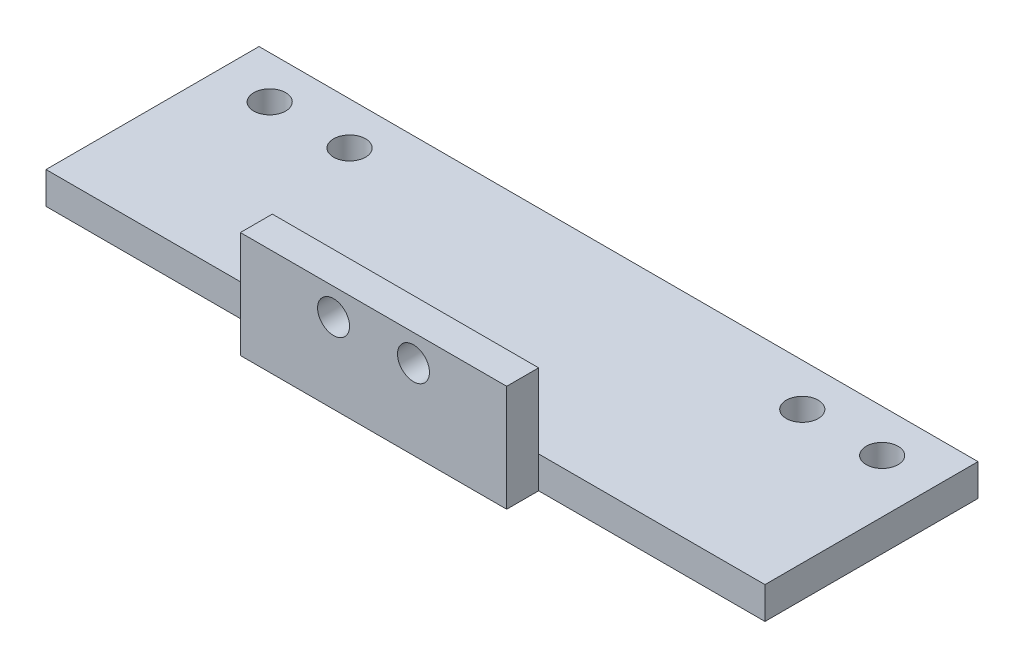
ISO-10303-21;
HEADER;
FILE_DESCRIPTION(('STEP AP214'),'2;1');
FILE_NAME('part.step','',(''),(''),'','','');
FILE_SCHEMA(('AUTOMOTIVE_DESIGN { 1 0 10303 214 1 1 1 1 }'));
ENDSEC;
DATA;
#1=APPLICATION_CONTEXT('core data for automotive mechanical design processes');
#2=APPLICATION_PROTOCOL_DEFINITION('international standard','automotive_design',2000,#1);
#3=PRODUCT_CONTEXT('',#1,'mechanical');
#4=PRODUCT('Part','Part','',(#3));
#5=PRODUCT_RELATED_PRODUCT_CATEGORY('part','',(#4));
#6=PRODUCT_DEFINITION_FORMATION('','',#4);
#7=PRODUCT_DEFINITION_CONTEXT('part definition',#1,'design');
#8=PRODUCT_DEFINITION('design','',#6,#7);
#9=PRODUCT_DEFINITION_SHAPE('','',#8);
#10=(LENGTH_UNIT() NAMED_UNIT(*) SI_UNIT(.MILLI.,.METRE.));
#11=(NAMED_UNIT(*) PLANE_ANGLE_UNIT() SI_UNIT($,.RADIAN.));
#12=(NAMED_UNIT(*) SI_UNIT($,.STERADIAN.) SOLID_ANGLE_UNIT());
#13=UNCERTAINTY_MEASURE_WITH_UNIT(LENGTH_MEASURE(1.E-05),#10,'distance_accuracy_value','');
#14=(GEOMETRIC_REPRESENTATION_CONTEXT(3) GLOBAL_UNCERTAINTY_ASSIGNED_CONTEXT((#13)) GLOBAL_UNIT_ASSIGNED_CONTEXT((#10,
#11,#12)) REPRESENTATION_CONTEXT('',''));
#15=CARTESIAN_POINT('',(0.,0.,0.));
#16=DIRECTION('',(0.,0.,1.));
#17=DIRECTION('',(1.,0.,0.));
#18=AXIS2_PLACEMENT_3D('',#15,#16,#17);
#19=CARTESIAN_POINT('',(-25.,20.,-3.));
#20=DIRECTION('',(0.,0.,1.));
#21=DIRECTION('',(1.,0.,0.));
#22=AXIS2_PLACEMENT_3D('',#19,#20,#21);
#23=PLANE('',#22);
#24=CARTESIAN_POINT('',(-7.49999999999999,15.,-3.));
#25=DIRECTION('',(0.,0.,-1.));
#26=DIRECTION('',(-1.,0.,0.));
#27=AXIS2_PLACEMENT_3D('',#24,#25,#26);
#28=CIRCLE('',#27,3.);
#29=CARTESIAN_POINT('',(-10.5,15.,-3.));
#30=VERTEX_POINT('',#29);
#31=EDGE_CURVE('E149',#30,#30,#28,.T.);
#32=ORIENTED_EDGE('',*,*,#31,.F.);
#33=EDGE_LOOP('',(#32));
#34=FACE_BOUND('',#33,.T.);
#35=CARTESIAN_POINT('',(7.50000000000001,15.,-3.));
#36=DIRECTION('',(0.,0.,-1.));
#37=DIRECTION('',(-1.,0.,0.));
#38=AXIS2_PLACEMENT_3D('',#35,#36,#37);
#39=CIRCLE('',#38,3.);
#40=CARTESIAN_POINT('',(4.50000000000001,15.,-3.));
#41=VERTEX_POINT('',#40);
#42=EDGE_CURVE('E165',#41,#41,#39,.T.);
#43=ORIENTED_EDGE('',*,*,#42,.F.);
#44=EDGE_LOOP('',(#43));
#45=FACE_BOUND('',#44,.T.);
#46=DIRECTION('',(1.,0.,0.));
#47=VECTOR('',#46,1.);
#48=CARTESIAN_POINT('',(67.5,6.00000000000001,-3.));
#49=LINE('',#48,#47);
#50=CARTESIAN_POINT('',(-25.,6.,-3.));
#51=VERTEX_POINT('',#50);
#52=CARTESIAN_POINT('',(25.,6.,-3.));
#53=VERTEX_POINT('',#52);
#54=EDGE_CURVE('E11',#51,#53,#49,.T.);
#55=ORIENTED_EDGE('',*,*,#54,.F.);
#56=DIRECTION('',(0.,-1.,0.));
#57=VECTOR('',#56,1.);
#58=CARTESIAN_POINT('',(-25.,20.,-3.));
#59=LINE('',#58,#57);
#60=CARTESIAN_POINT('',(-25.,20.,-3.));
#61=VERTEX_POINT('',#60);
#62=EDGE_CURVE('E195',#61,#51,#59,.T.);
#63=ORIENTED_EDGE('',*,*,#62,.F.);
#64=DIRECTION('',(-1.,0.,0.));
#65=VECTOR('',#64,1.);
#66=CARTESIAN_POINT('',(-25.,20.,-3.));
#67=LINE('',#66,#65);
#68=CARTESIAN_POINT('',(25.,20.,-3.));
#69=VERTEX_POINT('',#68);
#70=EDGE_CURVE('E91',#69,#61,#67,.T.);
#71=ORIENTED_EDGE('',*,*,#70,.F.);
#72=DIRECTION('',(0.,-1.,0.));
#73=VECTOR('',#72,1.);
#74=CARTESIAN_POINT('',(25.,20.,-3.));
#75=LINE('',#74,#73);
#76=EDGE_CURVE('E43',#69,#53,#75,.T.);
#77=ORIENTED_EDGE('',*,*,#76,.T.);
#78=EDGE_LOOP('',(#55,#63,#71,#77));
#79=FACE_BOUND('',#78,.T.);
#80=ADVANCED_FACE('F39',(#34,#45,#79),#23,.F.);
#81=CARTESIAN_POINT('',(25.,20.,-3.));
#82=DIRECTION('',(-1.,0.,0.));
#83=DIRECTION('',(0.,0.,1.));
#84=AXIS2_PLACEMENT_3D('',#81,#82,#83);
#85=PLANE('',#84);
#86=DIRECTION('',(0.,0.,-1.));
#87=VECTOR('',#86,1.);
#88=CARTESIAN_POINT('',(25.,0.,-3.));
#89=LINE('',#88,#87);
#90=CARTESIAN_POINT('',(25.,0.,3.));
#91=VERTEX_POINT('',#90);
#92=CARTESIAN_POINT('',(25.,0.,-3.));
#93=VERTEX_POINT('',#92);
#94=EDGE_CURVE('E164',#91,#93,#89,.T.);
#95=ORIENTED_EDGE('',*,*,#94,.T.);
#96=EDGE_CURVE('E197',#53,#93,#75,.T.);
#97=ORIENTED_EDGE('',*,*,#96,.F.);
#98=ORIENTED_EDGE('',*,*,#76,.F.);
#99=DIRECTION('',(0.,0.,-1.));
#100=VECTOR('',#99,1.);
#101=CARTESIAN_POINT('',(25.,20.,-3.));
#102=LINE('',#101,#100);
#103=CARTESIAN_POINT('',(25.,20.,3.));
#104=VERTEX_POINT('',#103);
#105=EDGE_CURVE('E172',#104,#69,#102,.T.);
#106=ORIENTED_EDGE('',*,*,#105,.F.);
#107=DIRECTION('',(0.,-1.,0.));
#108=VECTOR('',#107,1.);
#109=CARTESIAN_POINT('',(25.,20.,3.));
#110=LINE('',#109,#108);
#111=EDGE_CURVE('E182',#104,#91,#110,.T.);
#112=ORIENTED_EDGE('',*,*,#111,.T.);
#113=EDGE_LOOP('',(#95,#97,#98,#106,#112));
#114=FACE_BOUND('',#113,.T.);
#115=ADVANCED_FACE('F41',(#114),#85,.F.);
#116=CARTESIAN_POINT('',(-25.,20.,-3.));
#117=DIRECTION('',(1.,0.,0.));
#118=DIRECTION('',(0.,0.,-1.));
#119=AXIS2_PLACEMENT_3D('',#116,#117,#118);
#120=PLANE('',#119);
#121=DIRECTION('',(0.,0.,1.));
#122=VECTOR('',#121,1.);
#123=CARTESIAN_POINT('',(-25.,0.,-3.));
#124=LINE('',#123,#122);
#125=CARTESIAN_POINT('',(-25.,0.,-3.));
#126=VERTEX_POINT('',#125);
#127=CARTESIAN_POINT('',(-25.,0.,3.));
#128=VERTEX_POINT('',#127);
#129=EDGE_CURVE('E185',#126,#128,#124,.T.);
#130=ORIENTED_EDGE('',*,*,#129,.T.);
#131=DIRECTION('',(0.,-1.,0.));
#132=VECTOR('',#131,1.);
#133=CARTESIAN_POINT('',(-25.,20.,3.));
#134=LINE('',#133,#132);
#135=CARTESIAN_POINT('',(-25.,20.,3.));
#136=VERTEX_POINT('',#135);
#137=EDGE_CURVE('E192',#136,#128,#134,.T.);
#138=ORIENTED_EDGE('',*,*,#137,.F.);
#139=DIRECTION('',(0.,0.,1.));
#140=VECTOR('',#139,1.);
#141=CARTESIAN_POINT('',(-25.,20.,-3.));
#142=LINE('',#141,#140);
#143=EDGE_CURVE('E177',#61,#136,#142,.T.);
#144=ORIENTED_EDGE('',*,*,#143,.F.);
#145=ORIENTED_EDGE('',*,*,#62,.T.);
#146=EDGE_CURVE('E194',#51,#126,#59,.T.);
#147=ORIENTED_EDGE('',*,*,#146,.T.);
#148=EDGE_LOOP('',(#130,#138,#144,#145,#147));
#149=FACE_BOUND('',#148,.T.);
#150=ADVANCED_FACE('F205',(#149),#120,.F.);
#151=CARTESIAN_POINT('',(-25.,20.,3.));
#152=DIRECTION('',(0.,0.,-1.));
#153=DIRECTION('',(-1.,0.,0.));
#154=AXIS2_PLACEMENT_3D('',#151,#152,#153);
#155=PLANE('',#154);
#156=CARTESIAN_POINT('',(7.50000000000001,15.,3.));
#157=DIRECTION('',(0.,0.,-1.));
#158=DIRECTION('',(-1.,0.,0.));
#159=AXIS2_PLACEMENT_3D('',#156,#157,#158);
#160=CIRCLE('',#159,3.);
#161=CARTESIAN_POINT('',(4.50000000000001,15.,3.));
#162=VERTEX_POINT('',#161);
#163=EDGE_CURVE('E160',#162,#162,#160,.T.);
#164=ORIENTED_EDGE('',*,*,#163,.T.);
#165=EDGE_LOOP('',(#164));
#166=FACE_BOUND('',#165,.T.);
#167=CARTESIAN_POINT('',(-7.49999999999999,15.,3.));
#168=DIRECTION('',(0.,0.,-1.));
#169=DIRECTION('',(-1.,0.,0.));
#170=AXIS2_PLACEMENT_3D('',#167,#168,#169);
#171=CIRCLE('',#170,3.);
#172=CARTESIAN_POINT('',(-10.5,15.,3.));
#173=VERTEX_POINT('',#172);
#174=EDGE_CURVE('E154',#173,#173,#171,.T.);
#175=ORIENTED_EDGE('',*,*,#174,.T.);
#176=EDGE_LOOP('',(#175));
#177=FACE_BOUND('',#176,.T.);
#178=DIRECTION('',(1.,0.,0.));
#179=VECTOR('',#178,1.);
#180=CARTESIAN_POINT('',(-25.,0.,3.));
#181=LINE('',#180,#179);
#182=EDGE_CURVE('E86',#128,#91,#181,.T.);
#183=ORIENTED_EDGE('',*,*,#182,.T.);
#184=ORIENTED_EDGE('',*,*,#111,.F.);
#185=DIRECTION('',(1.,0.,0.));
#186=VECTOR('',#185,1.);
#187=CARTESIAN_POINT('',(-25.,20.,3.));
#188=LINE('',#187,#186);
#189=EDGE_CURVE('E65',#136,#104,#188,.T.);
#190=ORIENTED_EDGE('',*,*,#189,.F.);
#191=ORIENTED_EDGE('',*,*,#137,.T.);
#192=EDGE_LOOP('',(#183,#184,#190,#191));
#193=FACE_BOUND('',#192,.T.);
#194=ADVANCED_FACE('F237',(#166,#177,#193),#155,.F.);
#195=CARTESIAN_POINT('',(0.,20.,0.));
#196=DIRECTION('',(0.,1.,0.));
#197=DIRECTION('',(0.,0.,1.));
#198=AXIS2_PLACEMENT_3D('',#195,#196,#197);
#199=PLANE('',#198);
#200=ORIENTED_EDGE('',*,*,#105,.T.);
#201=ORIENTED_EDGE('',*,*,#70,.T.);
#202=ORIENTED_EDGE('',*,*,#143,.T.);
#203=ORIENTED_EDGE('',*,*,#189,.T.);
#204=EDGE_LOOP('',(#200,#201,#202,#203));
#205=FACE_BOUND('',#204,.T.);
#206=ADVANCED_FACE('F238',(#205),#199,.T.);
#207=CARTESIAN_POINT('',(0.,0.,0.));
#208=DIRECTION('',(0.,1.,0.));
#209=DIRECTION('',(0.,0.,1.));
#210=AXIS2_PLACEMENT_3D('',#207,#208,#209);
#211=PLANE('',#210);
#212=CARTESIAN_POINT('',(-57.5,0.,-35.));
#213=DIRECTION('',(0.,1.,0.));
#214=DIRECTION('',(-1.,0.,0.));
#215=AXIS2_PLACEMENT_3D('',#212,#213,#214);
#216=CIRCLE('',#215,3.);
#217=CARTESIAN_POINT('',(-60.5,0.,-35.));
#218=VERTEX_POINT('',#217);
#219=EDGE_CURVE('E297',#218,#218,#216,.T.);
#220=ORIENTED_EDGE('',*,*,#219,.T.);
#221=EDGE_LOOP('',(#220));
#222=FACE_BOUND('',#221,.T.);
#223=CARTESIAN_POINT('',(-42.5,0.,-35.));
#224=DIRECTION('',(0.,1.,0.));
#225=DIRECTION('',(-1.,0.,0.));
#226=AXIS2_PLACEMENT_3D('',#223,#224,#225);
#227=CIRCLE('',#226,3.);
#228=CARTESIAN_POINT('',(-45.5,0.,-35.));
#229=VERTEX_POINT('',#228);
#230=EDGE_CURVE('E302',#229,#229,#227,.T.);
#231=ORIENTED_EDGE('',*,*,#230,.T.);
#232=EDGE_LOOP('',(#231));
#233=FACE_BOUND('',#232,.T.);
#234=CARTESIAN_POINT('',(42.5,0.,-35.));
#235=DIRECTION('',(0.,1.,0.));
#236=DIRECTION('',(1.,0.,0.));
#237=AXIS2_PLACEMENT_3D('',#234,#235,#236);
#238=CIRCLE('',#237,3.);
#239=CARTESIAN_POINT('',(45.5,0.,-35.));
#240=VERTEX_POINT('',#239);
#241=EDGE_CURVE('E314',#240,#240,#238,.T.);
#242=ORIENTED_EDGE('',*,*,#241,.T.);
#243=EDGE_LOOP('',(#242));
#244=FACE_BOUND('',#243,.T.);
#245=CARTESIAN_POINT('',(57.5,0.,-35.));
#246=DIRECTION('',(0.,1.,0.));
#247=DIRECTION('',(1.,0.,0.));
#248=AXIS2_PLACEMENT_3D('',#245,#246,#247);
#249=CIRCLE('',#248,3.);
#250=CARTESIAN_POINT('',(60.5,0.,-35.));
#251=VERTEX_POINT('',#250);
#252=EDGE_CURVE('E322',#251,#251,#249,.T.);
#253=ORIENTED_EDGE('',*,*,#252,.T.);
#254=EDGE_LOOP('',(#253));
#255=FACE_BOUND('',#254,.T.);
#256=ORIENTED_EDGE('',*,*,#94,.F.);
#257=ORIENTED_EDGE('',*,*,#182,.F.);
#258=ORIENTED_EDGE('',*,*,#129,.F.);
#259=DIRECTION('',(-1.,0.,0.));
#260=VECTOR('',#259,1.);
#261=CARTESIAN_POINT('',(67.5,0.,-3.));
#262=LINE('',#261,#260);
#263=CARTESIAN_POINT('',(-67.5,0.,-3.));
#264=VERTEX_POINT('',#263);
#265=EDGE_CURVE('E212',#126,#264,#262,.T.);
#266=ORIENTED_EDGE('',*,*,#265,.T.);
#267=DIRECTION('',(0.,0.,1.));
#268=VECTOR('',#267,1.);
#269=CARTESIAN_POINT('',(-67.5,0.,-43.));
#270=LINE('',#269,#268);
#271=CARTESIAN_POINT('',(-67.5,0.,-43.));
#272=VERTEX_POINT('',#271);
#273=EDGE_CURVE('E222',#272,#264,#270,.T.);
#274=ORIENTED_EDGE('',*,*,#273,.F.);
#275=DIRECTION('',(-1.,0.,0.));
#276=VECTOR('',#275,1.);
#277=CARTESIAN_POINT('',(67.5,0.,-43.));
#278=LINE('',#277,#276);
#279=CARTESIAN_POINT('',(67.5,0.,-43.));
#280=VERTEX_POINT('',#279);
#281=EDGE_CURVE('E138',#280,#272,#278,.T.);
#282=ORIENTED_EDGE('',*,*,#281,.F.);
#283=DIRECTION('',(0.,0.,1.));
#284=VECTOR('',#283,1.);
#285=CARTESIAN_POINT('',(67.5,0.,-43.));
#286=LINE('',#285,#284);
#287=CARTESIAN_POINT('',(67.5,0.,-3.));
#288=VERTEX_POINT('',#287);
#289=EDGE_CURVE('E156',#280,#288,#286,.T.);
#290=ORIENTED_EDGE('',*,*,#289,.T.);
#291=EDGE_CURVE('E143',#288,#93,#262,.T.);
#292=ORIENTED_EDGE('',*,*,#291,.T.);
#293=EDGE_LOOP('',(#256,#257,#258,#266,#274,#282,#290,#292));
#294=FACE_BOUND('',#293,.T.);
#295=ADVANCED_FACE('F211',(#222,#233,#244,#255,#294),#211,.F.);
#296=CARTESIAN_POINT('',(-7.49999999999999,15.,3.));
#297=DIRECTION('',(0.,0.,-1.));
#298=DIRECTION('',(-1.,0.,0.));
#299=AXIS2_PLACEMENT_3D('',#296,#297,#298);
#300=CYLINDRICAL_SURFACE('',#299,3.);
#301=ORIENTED_EDGE('',*,*,#174,.F.);
#302=EDGE_LOOP('',(#301));
#303=FACE_BOUND('',#302,.T.);
#304=ORIENTED_EDGE('',*,*,#31,.T.);
#305=EDGE_LOOP('',(#304));
#306=FACE_BOUND('',#305,.T.);
#307=ADVANCED_FACE('F254',(#303,#306),#300,.F.);
#308=CARTESIAN_POINT('',(7.50000000000001,15.,3.));
#309=DIRECTION('',(0.,0.,-1.));
#310=DIRECTION('',(-1.,0.,0.));
#311=AXIS2_PLACEMENT_3D('',#308,#309,#310);
#312=CYLINDRICAL_SURFACE('',#311,3.);
#313=ORIENTED_EDGE('',*,*,#163,.F.);
#314=EDGE_LOOP('',(#313));
#315=FACE_BOUND('',#314,.T.);
#316=ORIENTED_EDGE('',*,*,#42,.T.);
#317=EDGE_LOOP('',(#316));
#318=FACE_BOUND('',#317,.T.);
#319=ADVANCED_FACE('F260',(#315,#318),#312,.F.);
#320=CARTESIAN_POINT('',(0.,0.,-3.));
#321=DIRECTION('',(0.,0.,-1.));
#322=DIRECTION('',(-1.,0.,0.));
#323=AXIS2_PLACEMENT_3D('',#320,#321,#322);
#324=PLANE('',#323);
#325=CARTESIAN_POINT('',(67.5,6.00000000000001,-3.));
#326=VERTEX_POINT('',#325);
#327=EDGE_CURVE('E51',#53,#326,#49,.T.);
#328=ORIENTED_EDGE('',*,*,#327,.F.);
#329=ORIENTED_EDGE('',*,*,#96,.T.);
#330=ORIENTED_EDGE('',*,*,#291,.F.);
#331=DIRECTION('',(0.,-1.,0.));
#332=VECTOR('',#331,1.);
#333=CARTESIAN_POINT('',(67.5,6.00000000000001,-3.));
#334=LINE('',#333,#332);
#335=EDGE_CURVE('E215',#326,#288,#334,.T.);
#336=ORIENTED_EDGE('',*,*,#335,.F.);
#337=EDGE_LOOP('',(#328,#329,#330,#336));
#338=FACE_BOUND('',#337,.T.);
#339=ADVANCED_FACE('F232',(#338),#324,.F.);
#340=CARTESIAN_POINT('',(-67.5,5.99999999999999,-43.));
#341=DIRECTION('',(1.,0.,0.));
#342=DIRECTION('',(0.,0.,-1.));
#343=AXIS2_PLACEMENT_3D('',#340,#341,#342);
#344=PLANE('',#343);
#345=DIRECTION('',(0.,1.,0.));
#346=VECTOR('',#345,1.);
#347=CARTESIAN_POINT('',(-67.5,5.99999999999999,-3.));
#348=LINE('',#347,#346);
#349=CARTESIAN_POINT('',(-67.5,5.99999999999999,-3.));
#350=VERTEX_POINT('',#349);
#351=EDGE_CURVE('E147',#264,#350,#348,.T.);
#352=ORIENTED_EDGE('',*,*,#351,.T.);
#353=DIRECTION('',(0.,0.,1.));
#354=VECTOR('',#353,1.);
#355=CARTESIAN_POINT('',(-67.5,5.99999999999999,-43.));
#356=LINE('',#355,#354);
#357=CARTESIAN_POINT('',(-67.5,5.99999999999999,-43.));
#358=VERTEX_POINT('',#357);
#359=EDGE_CURVE('E125',#358,#350,#356,.T.);
#360=ORIENTED_EDGE('',*,*,#359,.F.);
#361=DIRECTION('',(0.,1.,0.));
#362=VECTOR('',#361,1.);
#363=CARTESIAN_POINT('',(-67.5,5.99999999999999,-43.));
#364=LINE('',#363,#362);
#365=EDGE_CURVE('E133',#272,#358,#364,.T.);
#366=ORIENTED_EDGE('',*,*,#365,.F.);
#367=ORIENTED_EDGE('',*,*,#273,.T.);
#368=EDGE_LOOP('',(#352,#360,#366,#367));
#369=FACE_BOUND('',#368,.T.);
#370=ADVANCED_FACE('F145',(#369),#344,.F.);
#371=CARTESIAN_POINT('',(67.5,6.00000000000001,-43.));
#372=DIRECTION('',(0.,-1.,0.));
#373=DIRECTION('',(1.,0.,0.));
#374=AXIS2_PLACEMENT_3D('',#371,#372,#373);
#375=PLANE('',#374);
#376=CARTESIAN_POINT('',(-57.5,5.99999999999999,-35.));
#377=DIRECTION('',(0.,1.,0.));
#378=DIRECTION('',(-1.,0.,0.));
#379=AXIS2_PLACEMENT_3D('',#376,#377,#378);
#380=CIRCLE('',#379,3.);
#381=CARTESIAN_POINT('',(-60.5,5.99999999999999,-35.));
#382=VERTEX_POINT('',#381);
#383=EDGE_CURVE('E300',#382,#382,#380,.T.);
#384=ORIENTED_EDGE('',*,*,#383,.F.);
#385=EDGE_LOOP('',(#384));
#386=FACE_BOUND('',#385,.T.);
#387=CARTESIAN_POINT('',(-42.5,5.99999999999999,-35.));
#388=DIRECTION('',(0.,1.,0.));
#389=DIRECTION('',(-1.,0.,0.));
#390=AXIS2_PLACEMENT_3D('',#387,#388,#389);
#391=CIRCLE('',#390,3.);
#392=CARTESIAN_POINT('',(-45.5,5.99999999999999,-35.));
#393=VERTEX_POINT('',#392);
#394=EDGE_CURVE('E308',#393,#393,#391,.T.);
#395=ORIENTED_EDGE('',*,*,#394,.F.);
#396=EDGE_LOOP('',(#395));
#397=FACE_BOUND('',#396,.T.);
#398=CARTESIAN_POINT('',(42.5,6.,-35.));
#399=DIRECTION('',(0.,1.,0.));
#400=DIRECTION('',(1.,0.,0.));
#401=AXIS2_PLACEMENT_3D('',#398,#399,#400);
#402=CIRCLE('',#401,3.);
#403=CARTESIAN_POINT('',(45.5,6.,-35.));
#404=VERTEX_POINT('',#403);
#405=EDGE_CURVE('E318',#404,#404,#402,.T.);
#406=ORIENTED_EDGE('',*,*,#405,.F.);
#407=EDGE_LOOP('',(#406));
#408=FACE_BOUND('',#407,.T.);
#409=CARTESIAN_POINT('',(57.5,6.,-35.));
#410=DIRECTION('',(0.,1.,0.));
#411=DIRECTION('',(1.,0.,0.));
#412=AXIS2_PLACEMENT_3D('',#409,#410,#411);
#413=CIRCLE('',#412,3.);
#414=CARTESIAN_POINT('',(60.5,6.,-35.));
#415=VERTEX_POINT('',#414);
#416=EDGE_CURVE('E326',#415,#415,#413,.T.);
#417=ORIENTED_EDGE('',*,*,#416,.F.);
#418=EDGE_LOOP('',(#417));
#419=FACE_BOUND('',#418,.T.);
#420=EDGE_CURVE('E50',#350,#51,#49,.T.);
#421=ORIENTED_EDGE('',*,*,#420,.T.);
#422=ORIENTED_EDGE('',*,*,#54,.T.);
#423=ORIENTED_EDGE('',*,*,#327,.T.);
#424=DIRECTION('',(0.,0.,1.));
#425=VECTOR('',#424,1.);
#426=CARTESIAN_POINT('',(67.5,6.00000000000001,-43.));
#427=LINE('',#426,#425);
#428=CARTESIAN_POINT('',(67.5,6.00000000000001,-43.));
#429=VERTEX_POINT('',#428);
#430=EDGE_CURVE('E128',#429,#326,#427,.T.);
#431=ORIENTED_EDGE('',*,*,#430,.F.);
#432=DIRECTION('',(1.,0.,0.));
#433=VECTOR('',#432,1.);
#434=CARTESIAN_POINT('',(67.5,6.00000000000001,-43.));
#435=LINE('',#434,#433);
#436=EDGE_CURVE('E120',#358,#429,#435,.T.);
#437=ORIENTED_EDGE('',*,*,#436,.F.);
#438=ORIENTED_EDGE('',*,*,#359,.T.);
#439=EDGE_LOOP('',(#421,#422,#423,#431,#437,#438));
#440=FACE_BOUND('',#439,.T.);
#441=ADVANCED_FACE('F123',(#386,#397,#408,#419,#440),#375,.F.);
#442=CARTESIAN_POINT('',(67.5,6.00000000000001,-43.));
#443=DIRECTION('',(-1.,0.,0.));
#444=DIRECTION('',(0.,0.,1.));
#445=AXIS2_PLACEMENT_3D('',#442,#443,#444);
#446=PLANE('',#445);
#447=ORIENTED_EDGE('',*,*,#335,.T.);
#448=ORIENTED_EDGE('',*,*,#289,.F.);
#449=DIRECTION('',(0.,-1.,0.));
#450=VECTOR('',#449,1.);
#451=CARTESIAN_POINT('',(67.5,6.00000000000001,-43.));
#452=LINE('',#451,#450);
#453=EDGE_CURVE('E132',#429,#280,#452,.T.);
#454=ORIENTED_EDGE('',*,*,#453,.F.);
#455=ORIENTED_EDGE('',*,*,#430,.T.);
#456=EDGE_LOOP('',(#447,#448,#454,#455));
#457=FACE_BOUND('',#456,.T.);
#458=ADVANCED_FACE('F269',(#457),#446,.F.);
#459=CARTESIAN_POINT('',(0.,0.,-43.));
#460=DIRECTION('',(0.,0.,-1.));
#461=DIRECTION('',(-1.,0.,0.));
#462=AXIS2_PLACEMENT_3D('',#459,#460,#461);
#463=PLANE('',#462);
#464=ORIENTED_EDGE('',*,*,#365,.T.);
#465=ORIENTED_EDGE('',*,*,#436,.T.);
#466=ORIENTED_EDGE('',*,*,#453,.T.);
#467=ORIENTED_EDGE('',*,*,#281,.T.);
#468=EDGE_LOOP('',(#464,#465,#466,#467));
#469=FACE_BOUND('',#468,.T.);
#470=ADVANCED_FACE('F136',(#469),#463,.T.);
#471=ORIENTED_EDGE('',*,*,#146,.F.);
#472=ORIENTED_EDGE('',*,*,#420,.F.);
#473=ORIENTED_EDGE('',*,*,#351,.F.);
#474=ORIENTED_EDGE('',*,*,#265,.F.);
#475=EDGE_LOOP('',(#471,#472,#473,#474));
#476=FACE_BOUND('',#475,.T.);
#477=ADVANCED_FACE('F213',(#476),#324,.F.);
#478=CARTESIAN_POINT('',(57.5,0.,-35.));
#479=DIRECTION('',(0.,1.,0.));
#480=DIRECTION('',(-1.,0.,0.));
#481=AXIS2_PLACEMENT_3D('',#478,#479,#480);
#482=CYLINDRICAL_SURFACE('',#481,3.);
#483=ORIENTED_EDGE('',*,*,#252,.F.);
#484=EDGE_LOOP('',(#483));
#485=FACE_BOUND('',#484,.T.);
#486=ORIENTED_EDGE('',*,*,#416,.T.);
#487=EDGE_LOOP('',(#486));
#488=FACE_BOUND('',#487,.T.);
#489=ADVANCED_FACE('F275',(#485,#488),#482,.F.);
#490=CARTESIAN_POINT('',(42.5,0.,-35.));
#491=DIRECTION('',(0.,1.,0.));
#492=DIRECTION('',(-1.,0.,0.));
#493=AXIS2_PLACEMENT_3D('',#490,#491,#492);
#494=CYLINDRICAL_SURFACE('',#493,3.);
#495=ORIENTED_EDGE('',*,*,#241,.F.);
#496=EDGE_LOOP('',(#495));
#497=FACE_BOUND('',#496,.T.);
#498=ORIENTED_EDGE('',*,*,#405,.T.);
#499=EDGE_LOOP('',(#498));
#500=FACE_BOUND('',#499,.T.);
#501=ADVANCED_FACE('F280',(#497,#500),#494,.F.);
#502=CARTESIAN_POINT('',(-42.5,0.,-35.));
#503=DIRECTION('',(0.,1.,0.));
#504=DIRECTION('',(-1.,0.,0.));
#505=AXIS2_PLACEMENT_3D('',#502,#503,#504);
#506=CYLINDRICAL_SURFACE('',#505,3.);
#507=ORIENTED_EDGE('',*,*,#230,.F.);
#508=EDGE_LOOP('',(#507));
#509=FACE_BOUND('',#508,.T.);
#510=ORIENTED_EDGE('',*,*,#394,.T.);
#511=EDGE_LOOP('',(#510));
#512=FACE_BOUND('',#511,.T.);
#513=ADVANCED_FACE('F284',(#509,#512),#506,.F.);
#514=CARTESIAN_POINT('',(-57.5,0.,-35.));
#515=DIRECTION('',(0.,1.,0.));
#516=DIRECTION('',(-1.,0.,0.));
#517=AXIS2_PLACEMENT_3D('',#514,#515,#516);
#518=CYLINDRICAL_SURFACE('',#517,3.);
#519=ORIENTED_EDGE('',*,*,#219,.F.);
#520=EDGE_LOOP('',(#519));
#521=FACE_BOUND('',#520,.T.);
#522=ORIENTED_EDGE('',*,*,#383,.T.);
#523=EDGE_LOOP('',(#522));
#524=FACE_BOUND('',#523,.T.);
#525=ADVANCED_FACE('F288',(#521,#524),#518,.F.);
#526=CLOSED_SHELL('',(#80,#115,#150,#194,#206,#295,#307,#319,#339,#370,#441,#458,#470,#477,#489,
#501,#513,#525));
#527=MANIFOLD_SOLID_BREP('B2',#526);
#528=ADVANCED_BREP_SHAPE_REPRESENTATION('',(#18,#527),#14);
#529=SHAPE_DEFINITION_REPRESENTATION(#9,#528);
ENDSEC;
END-ISO-10303-21;
